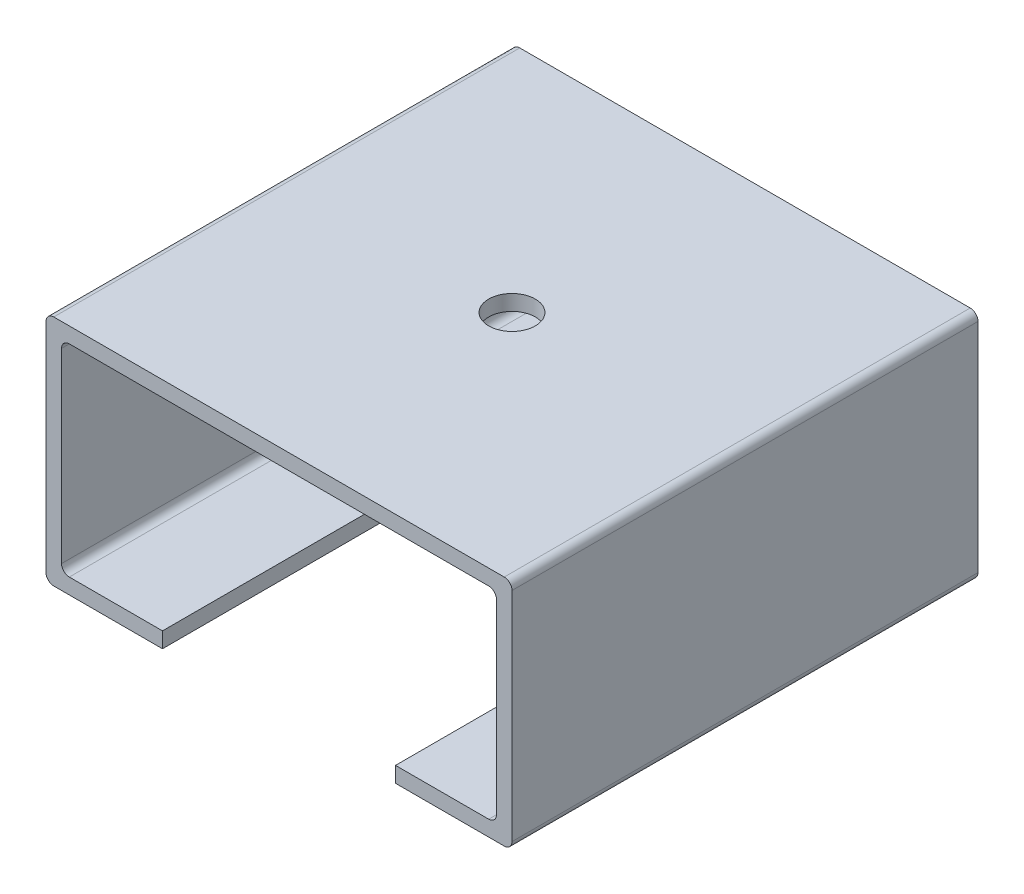
ISO-10303-21;
HEADER;
FILE_DESCRIPTION(('STEP AP214'),'2;1');
FILE_NAME('part.step','',(''),(''),'','','');
FILE_SCHEMA(('AUTOMOTIVE_DESIGN { 1 0 10303 214 1 1 1 1 }'));
ENDSEC;
DATA;
#1=APPLICATION_CONTEXT('core data for automotive mechanical design processes');
#2=APPLICATION_PROTOCOL_DEFINITION('international standard','automotive_design',2000,#1);
#3=PRODUCT_CONTEXT('',#1,'mechanical');
#4=PRODUCT('Part','Part','',(#3));
#5=PRODUCT_RELATED_PRODUCT_CATEGORY('part','',(#4));
#6=PRODUCT_DEFINITION_FORMATION('','',#4);
#7=PRODUCT_DEFINITION_CONTEXT('part definition',#1,'design');
#8=PRODUCT_DEFINITION('design','',#6,#7);
#9=PRODUCT_DEFINITION_SHAPE('','',#8);
#10=(LENGTH_UNIT() NAMED_UNIT(*) SI_UNIT(.MILLI.,.METRE.));
#11=(NAMED_UNIT(*) PLANE_ANGLE_UNIT() SI_UNIT($,.RADIAN.));
#12=(NAMED_UNIT(*) SI_UNIT($,.STERADIAN.) SOLID_ANGLE_UNIT());
#13=UNCERTAINTY_MEASURE_WITH_UNIT(LENGTH_MEASURE(1.E-05),#10,'distance_accuracy_value','');
#14=(GEOMETRIC_REPRESENTATION_CONTEXT(3) GLOBAL_UNCERTAINTY_ASSIGNED_CONTEXT((#13)) GLOBAL_UNIT_ASSIGNED_CONTEXT((#10,
#11,#12)) REPRESENTATION_CONTEXT('',''));
#15=CARTESIAN_POINT('',(0.,0.,0.));
#16=DIRECTION('',(0.,0.,1.));
#17=DIRECTION('',(1.,0.,0.));
#18=AXIS2_PLACEMENT_3D('',#15,#16,#17);
#19=CARTESIAN_POINT('',(15.,0.,60.));
#20=DIRECTION('',(1.,0.,0.));
#21=DIRECTION('',(0.,0.,-1.));
#22=AXIS2_PLACEMENT_3D('',#19,#20,#21);
#23=PLANE('',#22);
#24=DIRECTION('',(0.,-1.,0.));
#25=VECTOR('',#24,1.);
#26=CARTESIAN_POINT('',(15.,0.,0.));
#27=LINE('',#26,#25);
#28=CARTESIAN_POINT('',(15.,2.,0.));
#29=VERTEX_POINT('',#28);
#30=CARTESIAN_POINT('',(15.,0.,0.));
#31=VERTEX_POINT('',#30);
#32=EDGE_CURVE('E193',#29,#31,#27,.T.);
#33=ORIENTED_EDGE('',*,*,#32,.T.);
#34=DIRECTION('',(0.,0.,-1.));
#35=VECTOR('',#34,1.);
#36=CARTESIAN_POINT('',(15.,0.,60.));
#37=LINE('',#36,#35);
#38=CARTESIAN_POINT('',(15.,0.,60.));
#39=VERTEX_POINT('',#38);
#40=EDGE_CURVE('E175',#39,#31,#37,.T.);
#41=ORIENTED_EDGE('',*,*,#40,.F.);
#42=DIRECTION('',(0.,-1.,0.));
#43=VECTOR('',#42,1.);
#44=CARTESIAN_POINT('',(15.,0.,60.));
#45=LINE('',#44,#43);
#46=CARTESIAN_POINT('',(15.,2.,60.));
#47=VERTEX_POINT('',#46);
#48=EDGE_CURVE('E181',#47,#39,#45,.T.);
#49=ORIENTED_EDGE('',*,*,#48,.F.);
#50=DIRECTION('',(0.,0.,-1.));
#51=VECTOR('',#50,1.);
#52=CARTESIAN_POINT('',(15.,2.,60.));
#53=LINE('',#52,#51);
#54=EDGE_CURVE('E306',#47,#29,#53,.T.);
#55=ORIENTED_EDGE('',*,*,#54,.T.);
#56=EDGE_LOOP('',(#33,#41,#49,#55));
#57=FACE_BOUND('',#56,.T.);
#58=ADVANCED_FACE('F32',(#57),#23,.F.);
#59=CARTESIAN_POINT('',(15.,0.,60.));
#60=DIRECTION('',(0.,1.,0.));
#61=DIRECTION('',(0.,0.,1.));
#62=AXIS2_PLACEMENT_3D('',#59,#60,#61);
#63=PLANE('',#62);
#64=DIRECTION('',(1.,0.,0.));
#65=VECTOR('',#64,1.);
#66=CARTESIAN_POINT('',(15.,0.,0.));
#67=LINE('',#66,#65);
#68=CARTESIAN_POINT('',(29.,0.,0.));
#69=VERTEX_POINT('',#68);
#70=EDGE_CURVE('E308',#31,#69,#67,.T.);
#71=ORIENTED_EDGE('',*,*,#70,.T.);
#72=DIRECTION('',(0.,0.,-1.));
#73=VECTOR('',#72,1.);
#74=CARTESIAN_POINT('',(29.,0.,60.));
#75=LINE('',#74,#73);
#76=CARTESIAN_POINT('',(29.,0.,60.));
#77=VERTEX_POINT('',#76);
#78=EDGE_CURVE('E178',#69,#77,#75,.F.);
#79=ORIENTED_EDGE('',*,*,#78,.T.);
#80=DIRECTION('',(1.,0.,0.));
#81=VECTOR('',#80,1.);
#82=CARTESIAN_POINT('',(15.,0.,60.));
#83=LINE('',#82,#81);
#84=EDGE_CURVE('E170',#39,#77,#83,.T.);
#85=ORIENTED_EDGE('',*,*,#84,.F.);
#86=ORIENTED_EDGE('',*,*,#40,.T.);
#87=EDGE_LOOP('',(#71,#79,#85,#86));
#88=FACE_BOUND('',#87,.T.);
#89=ADVANCED_FACE('F173',(#88),#63,.F.);
#90=CARTESIAN_POINT('',(30.,0.,60.));
#91=DIRECTION('',(-1.,0.,0.));
#92=DIRECTION('',(0.,0.,1.));
#93=AXIS2_PLACEMENT_3D('',#90,#91,#92);
#94=PLANE('',#93);
#95=DIRECTION('',(0.,1.,0.));
#96=VECTOR('',#95,1.);
#97=CARTESIAN_POINT('',(30.,0.,60.));
#98=LINE('',#97,#96);
#99=CARTESIAN_POINT('',(30.,1.,60.));
#100=VERTEX_POINT('',#99);
#101=CARTESIAN_POINT('',(30.,29.,60.));
#102=VERTEX_POINT('',#101);
#103=EDGE_CURVE('E180',#100,#102,#98,.T.);
#104=ORIENTED_EDGE('',*,*,#103,.F.);
#105=DIRECTION('',(0.,0.,-1.));
#106=VECTOR('',#105,1.);
#107=CARTESIAN_POINT('',(30.,1.,60.));
#108=LINE('',#107,#106);
#109=CARTESIAN_POINT('',(30.,1.,0.));
#110=VERTEX_POINT('',#109);
#111=EDGE_CURVE('E227',#100,#110,#108,.T.);
#112=ORIENTED_EDGE('',*,*,#111,.T.);
#113=DIRECTION('',(0.,1.,0.));
#114=VECTOR('',#113,1.);
#115=CARTESIAN_POINT('',(30.,0.,0.));
#116=LINE('',#115,#114);
#117=CARTESIAN_POINT('',(30.,29.,0.));
#118=VERTEX_POINT('',#117);
#119=EDGE_CURVE('E311',#110,#118,#116,.T.);
#120=ORIENTED_EDGE('',*,*,#119,.T.);
#121=DIRECTION('',(0.,0.,-1.));
#122=VECTOR('',#121,1.);
#123=CARTESIAN_POINT('',(30.,29.,60.));
#124=LINE('',#123,#122);
#125=EDGE_CURVE('E225',#118,#102,#124,.F.);
#126=ORIENTED_EDGE('',*,*,#125,.T.);
#127=EDGE_LOOP('',(#104,#112,#120,#126));
#128=FACE_BOUND('',#127,.T.);
#129=ADVANCED_FACE('F340',(#128),#94,.F.);
#130=CARTESIAN_POINT('',(30.,30.,60.));
#131=DIRECTION('',(0.,-1.,0.));
#132=DIRECTION('',(1.,0.,0.));
#133=AXIS2_PLACEMENT_3D('',#130,#131,#132);
#134=PLANE('',#133);
#135=CARTESIAN_POINT('',(0.,30.,30.));
#136=DIRECTION('',(0.,1.,0.));
#137=DIRECTION('',(-1.,0.,0.));
#138=AXIS2_PLACEMENT_3D('',#135,#136,#137);
#139=CIRCLE('',#138,3.);
#140=CARTESIAN_POINT('',(-3.,30.,30.));
#141=VERTEX_POINT('',#140);
#142=EDGE_CURVE('E550',#141,#141,#139,.T.);
#143=ORIENTED_EDGE('',*,*,#142,.F.);
#144=EDGE_LOOP('',(#143));
#145=FACE_BOUND('',#144,.T.);
#146=DIRECTION('',(-1.,0.,0.));
#147=VECTOR('',#146,1.);
#148=CARTESIAN_POINT('',(30.,30.,60.));
#149=LINE('',#148,#147);
#150=CARTESIAN_POINT('',(29.,30.,60.));
#151=VERTEX_POINT('',#150);
#152=CARTESIAN_POINT('',(-29.,30.,60.));
#153=VERTEX_POINT('',#152);
#154=EDGE_CURVE('E342',#151,#153,#149,.T.);
#155=ORIENTED_EDGE('',*,*,#154,.F.);
#156=DIRECTION('',(0.,0.,-1.));
#157=VECTOR('',#156,1.);
#158=CARTESIAN_POINT('',(29.,30.,60.));
#159=LINE('',#158,#157);
#160=CARTESIAN_POINT('',(29.,30.,0.));
#161=VERTEX_POINT('',#160);
#162=EDGE_CURVE('E233',#151,#161,#159,.T.);
#163=ORIENTED_EDGE('',*,*,#162,.T.);
#164=DIRECTION('',(-1.,0.,0.));
#165=VECTOR('',#164,1.);
#166=CARTESIAN_POINT('',(30.,30.,0.));
#167=LINE('',#166,#165);
#168=CARTESIAN_POINT('',(-29.,30.,0.));
#169=VERTEX_POINT('',#168);
#170=EDGE_CURVE('E314',#161,#169,#167,.T.);
#171=ORIENTED_EDGE('',*,*,#170,.T.);
#172=DIRECTION('',(0.,0.,-1.));
#173=VECTOR('',#172,1.);
#174=CARTESIAN_POINT('',(-29.,30.,60.));
#175=LINE('',#174,#173);
#176=EDGE_CURVE('E231',#169,#153,#175,.F.);
#177=ORIENTED_EDGE('',*,*,#176,.T.);
#178=EDGE_LOOP('',(#155,#163,#171,#177));
#179=FACE_BOUND('',#178,.T.);
#180=ADVANCED_FACE('F374',(#145,#179),#134,.F.);
#181=CARTESIAN_POINT('',(-30.,30.,60.));
#182=DIRECTION('',(1.,0.,0.));
#183=DIRECTION('',(0.,0.,-1.));
#184=AXIS2_PLACEMENT_3D('',#181,#182,#183);
#185=PLANE('',#184);
#186=DIRECTION('',(0.,-1.,0.));
#187=VECTOR('',#186,1.);
#188=CARTESIAN_POINT('',(-30.,30.,0.));
#189=LINE('',#188,#187);
#190=CARTESIAN_POINT('',(-30.,29.,0.));
#191=VERTEX_POINT('',#190);
#192=CARTESIAN_POINT('',(-30.,1.,0.));
#193=VERTEX_POINT('',#192);
#194=EDGE_CURVE('E317',#191,#193,#189,.T.);
#195=ORIENTED_EDGE('',*,*,#194,.T.);
#196=DIRECTION('',(0.,0.,-1.));
#197=VECTOR('',#196,1.);
#198=CARTESIAN_POINT('',(-30.,1.,60.));
#199=LINE('',#198,#197);
#200=CARTESIAN_POINT('',(-30.,1.,60.));
#201=VERTEX_POINT('',#200);
#202=EDGE_CURVE('E215',#193,#201,#199,.F.);
#203=ORIENTED_EDGE('',*,*,#202,.T.);
#204=DIRECTION('',(0.,-1.,0.));
#205=VECTOR('',#204,1.);
#206=CARTESIAN_POINT('',(-30.,30.,60.));
#207=LINE('',#206,#205);
#208=CARTESIAN_POINT('',(-30.,29.,60.));
#209=VERTEX_POINT('',#208);
#210=EDGE_CURVE('E345',#209,#201,#207,.T.);
#211=ORIENTED_EDGE('',*,*,#210,.F.);
#212=DIRECTION('',(0.,0.,-1.));
#213=VECTOR('',#212,1.);
#214=CARTESIAN_POINT('',(-30.,29.,60.));
#215=LINE('',#214,#213);
#216=EDGE_CURVE('E212',#209,#191,#215,.T.);
#217=ORIENTED_EDGE('',*,*,#216,.T.);
#218=EDGE_LOOP('',(#195,#203,#211,#217));
#219=FACE_BOUND('',#218,.T.);
#220=ADVANCED_FACE('F365',(#219),#185,.F.);
#221=CARTESIAN_POINT('',(-30.,0.,60.));
#222=DIRECTION('',(0.,1.,0.));
#223=DIRECTION('',(0.,0.,1.));
#224=AXIS2_PLACEMENT_3D('',#221,#222,#223);
#225=PLANE('',#224);
#226=DIRECTION('',(1.,0.,0.));
#227=VECTOR('',#226,1.);
#228=CARTESIAN_POINT('',(-30.,0.,60.));
#229=LINE('',#228,#227);
#230=CARTESIAN_POINT('',(-29.,0.,60.));
#231=VERTEX_POINT('',#230);
#232=CARTESIAN_POINT('',(-15.,0.,60.));
#233=VERTEX_POINT('',#232);
#234=EDGE_CURVE('E349',#231,#233,#229,.T.);
#235=ORIENTED_EDGE('',*,*,#234,.F.);
#236=DIRECTION('',(0.,0.,-1.));
#237=VECTOR('',#236,1.);
#238=CARTESIAN_POINT('',(-29.,0.,60.));
#239=LINE('',#238,#237);
#240=CARTESIAN_POINT('',(-29.,0.,0.));
#241=VERTEX_POINT('',#240);
#242=EDGE_CURVE('E194',#231,#241,#239,.T.);
#243=ORIENTED_EDGE('',*,*,#242,.T.);
#244=DIRECTION('',(1.,0.,0.));
#245=VECTOR('',#244,1.);
#246=CARTESIAN_POINT('',(-30.,0.,0.));
#247=LINE('',#246,#245);
#248=CARTESIAN_POINT('',(-15.,0.,0.));
#249=VERTEX_POINT('',#248);
#250=EDGE_CURVE('E320',#241,#249,#247,.T.);
#251=ORIENTED_EDGE('',*,*,#250,.T.);
#252=DIRECTION('',(0.,0.,-1.));
#253=VECTOR('',#252,1.);
#254=CARTESIAN_POINT('',(-15.,0.,60.));
#255=LINE('',#254,#253);
#256=EDGE_CURVE('E195',#233,#249,#255,.T.);
#257=ORIENTED_EDGE('',*,*,#256,.F.);
#258=EDGE_LOOP('',(#235,#243,#251,#257));
#259=FACE_BOUND('',#258,.T.);
#260=ADVANCED_FACE('F357',(#259),#225,.F.);
#261=CARTESIAN_POINT('',(-15.,0.,60.));
#262=DIRECTION('',(-1.,0.,0.));
#263=DIRECTION('',(0.,0.,1.));
#264=AXIS2_PLACEMENT_3D('',#261,#262,#263);
#265=PLANE('',#264);
#266=DIRECTION('',(0.,1.,0.));
#267=VECTOR('',#266,1.);
#268=CARTESIAN_POINT('',(-15.,0.,0.));
#269=LINE('',#268,#267);
#270=CARTESIAN_POINT('',(-15.,2.,0.));
#271=VERTEX_POINT('',#270);
#272=EDGE_CURVE('E284',#249,#271,#269,.T.);
#273=ORIENTED_EDGE('',*,*,#272,.T.);
#274=DIRECTION('',(0.,0.,-1.));
#275=VECTOR('',#274,1.);
#276=CARTESIAN_POINT('',(-15.,2.,60.));
#277=LINE('',#276,#275);
#278=CARTESIAN_POINT('',(-15.,2.,60.));
#279=VERTEX_POINT('',#278);
#280=EDGE_CURVE('E201',#279,#271,#277,.T.);
#281=ORIENTED_EDGE('',*,*,#280,.F.);
#282=DIRECTION('',(0.,1.,0.));
#283=VECTOR('',#282,1.);
#284=CARTESIAN_POINT('',(-15.,0.,60.));
#285=LINE('',#284,#283);
#286=EDGE_CURVE('E300',#233,#279,#285,.T.);
#287=ORIENTED_EDGE('',*,*,#286,.F.);
#288=ORIENTED_EDGE('',*,*,#256,.T.);
#289=EDGE_LOOP('',(#273,#281,#287,#288));
#290=FACE_BOUND('',#289,.T.);
#291=ADVANCED_FACE('F354',(#290),#265,.F.);
#292=CARTESIAN_POINT('',(-15.,2.,60.));
#293=DIRECTION('',(0.,-1.,0.));
#294=DIRECTION('',(1.,0.,0.));
#295=AXIS2_PLACEMENT_3D('',#292,#293,#294);
#296=PLANE('',#295);
#297=DIRECTION('',(-1.,0.,0.));
#298=VECTOR('',#297,1.);
#299=CARTESIAN_POINT('',(-15.,2.,0.));
#300=LINE('',#299,#298);
#301=CARTESIAN_POINT('',(-27.,2.,0.));
#302=VERTEX_POINT('',#301);
#303=EDGE_CURVE('E272',#271,#302,#300,.T.);
#304=ORIENTED_EDGE('',*,*,#303,.T.);
#305=DIRECTION('',(0.,0.,-1.));
#306=VECTOR('',#305,1.);
#307=CARTESIAN_POINT('',(-27.,2.,60.));
#308=LINE('',#307,#306);
#309=CARTESIAN_POINT('',(-27.,2.,60.));
#310=VERTEX_POINT('',#309);
#311=EDGE_CURVE('E253',#302,#310,#308,.F.);
#312=ORIENTED_EDGE('',*,*,#311,.T.);
#313=DIRECTION('',(-1.,0.,0.));
#314=VECTOR('',#313,1.);
#315=CARTESIAN_POINT('',(-15.,2.,60.));
#316=LINE('',#315,#314);
#317=EDGE_CURVE('E291',#279,#310,#316,.T.);
#318=ORIENTED_EDGE('',*,*,#317,.F.);
#319=ORIENTED_EDGE('',*,*,#280,.T.);
#320=EDGE_LOOP('',(#304,#312,#318,#319));
#321=FACE_BOUND('',#320,.T.);
#322=ADVANCED_FACE('F280',(#321),#296,.F.);
#323=CARTESIAN_POINT('',(-28.,2.,60.));
#324=DIRECTION('',(-1.,0.,0.));
#325=DIRECTION('',(0.,0.,1.));
#326=AXIS2_PLACEMENT_3D('',#323,#324,#325);
#327=PLANE('',#326);
#328=DIRECTION('',(0.,1.,0.));
#329=VECTOR('',#328,1.);
#330=CARTESIAN_POINT('',(-28.,2.,0.));
#331=LINE('',#330,#329);
#332=CARTESIAN_POINT('',(-28.,3.,0.));
#333=VERTEX_POINT('',#332);
#334=CARTESIAN_POINT('',(-28.,27.,0.));
#335=VERTEX_POINT('',#334);
#336=EDGE_CURVE('E274',#333,#335,#331,.T.);
#337=ORIENTED_EDGE('',*,*,#336,.T.);
#338=DIRECTION('',(0.,0.,-1.));
#339=VECTOR('',#338,1.);
#340=CARTESIAN_POINT('',(-28.,27.,60.));
#341=LINE('',#340,#339);
#342=CARTESIAN_POINT('',(-28.,27.,60.));
#343=VERTEX_POINT('',#342);
#344=EDGE_CURVE('E251',#335,#343,#341,.F.);
#345=ORIENTED_EDGE('',*,*,#344,.T.);
#346=DIRECTION('',(0.,1.,0.));
#347=VECTOR('',#346,1.);
#348=CARTESIAN_POINT('',(-28.,2.,60.));
#349=LINE('',#348,#347);
#350=CARTESIAN_POINT('',(-28.,3.,60.));
#351=VERTEX_POINT('',#350);
#352=EDGE_CURVE('E289',#351,#343,#349,.T.);
#353=ORIENTED_EDGE('',*,*,#352,.F.);
#354=DIRECTION('',(0.,0.,-1.));
#355=VECTOR('',#354,1.);
#356=CARTESIAN_POINT('',(-28.,3.,0.));
#357=LINE('',#356,#355);
#358=EDGE_CURVE('E248',#351,#333,#357,.T.);
#359=ORIENTED_EDGE('',*,*,#358,.T.);
#360=EDGE_LOOP('',(#337,#345,#353,#359));
#361=FACE_BOUND('',#360,.T.);
#362=ADVANCED_FACE('F293',(#361),#327,.F.);
#363=CARTESIAN_POINT('',(28.,28.,60.));
#364=DIRECTION('',(0.,1.,0.));
#365=DIRECTION('',(0.,0.,1.));
#366=AXIS2_PLACEMENT_3D('',#363,#364,#365);
#367=PLANE('',#366);
#368=CARTESIAN_POINT('',(0.,28.,30.));
#369=DIRECTION('',(0.,1.,0.));
#370=DIRECTION('',(-1.,0.,0.));
#371=AXIS2_PLACEMENT_3D('',#368,#369,#370);
#372=CIRCLE('',#371,3.);
#373=CARTESIAN_POINT('',(-3.,28.,30.));
#374=VERTEX_POINT('',#373);
#375=EDGE_CURVE('E309',#374,#374,#372,.T.);
#376=ORIENTED_EDGE('',*,*,#375,.T.);
#377=EDGE_LOOP('',(#376));
#378=FACE_BOUND('',#377,.T.);
#379=DIRECTION('',(1.,0.,0.));
#380=VECTOR('',#379,1.);
#381=CARTESIAN_POINT('',(28.,28.,0.));
#382=LINE('',#381,#380);
#383=CARTESIAN_POINT('',(-27.,28.,0.));
#384=VERTEX_POINT('',#383);
#385=CARTESIAN_POINT('',(27.,28.,0.));
#386=VERTEX_POINT('',#385);
#387=EDGE_CURVE('E324',#384,#386,#382,.T.);
#388=ORIENTED_EDGE('',*,*,#387,.T.);
#389=DIRECTION('',(0.,0.,-1.));
#390=VECTOR('',#389,1.);
#391=CARTESIAN_POINT('',(27.,28.,60.));
#392=LINE('',#391,#390);
#393=CARTESIAN_POINT('',(27.,28.,60.));
#394=VERTEX_POINT('',#393);
#395=EDGE_CURVE('E246',#386,#394,#392,.F.);
#396=ORIENTED_EDGE('',*,*,#395,.T.);
#397=DIRECTION('',(1.,0.,0.));
#398=VECTOR('',#397,1.);
#399=CARTESIAN_POINT('',(28.,28.,60.));
#400=LINE('',#399,#398);
#401=CARTESIAN_POINT('',(-27.,28.,60.));
#402=VERTEX_POINT('',#401);
#403=EDGE_CURVE('E295',#402,#394,#400,.T.);
#404=ORIENTED_EDGE('',*,*,#403,.F.);
#405=DIRECTION('',(0.,0.,-1.));
#406=VECTOR('',#405,1.);
#407=CARTESIAN_POINT('',(-27.,28.,0.));
#408=LINE('',#407,#406);
#409=EDGE_CURVE('E243',#402,#384,#408,.T.);
#410=ORIENTED_EDGE('',*,*,#409,.T.);
#411=EDGE_LOOP('',(#388,#396,#404,#410));
#412=FACE_BOUND('',#411,.T.);
#413=ADVANCED_FACE('F412',(#378,#412),#367,.F.);
#414=CARTESIAN_POINT('',(28.,2.,60.));
#415=DIRECTION('',(1.,0.,0.));
#416=DIRECTION('',(0.,0.,-1.));
#417=AXIS2_PLACEMENT_3D('',#414,#415,#416);
#418=PLANE('',#417);
#419=DIRECTION('',(0.,-1.,0.));
#420=VECTOR('',#419,1.);
#421=CARTESIAN_POINT('',(28.,2.,0.));
#422=LINE('',#421,#420);
#423=CARTESIAN_POINT('',(28.,27.,0.));
#424=VERTEX_POINT('',#423);
#425=CARTESIAN_POINT('',(28.,3.,0.));
#426=VERTEX_POINT('',#425);
#427=EDGE_CURVE('E327',#424,#426,#422,.T.);
#428=ORIENTED_EDGE('',*,*,#427,.T.);
#429=DIRECTION('',(0.,0.,-1.));
#430=VECTOR('',#429,1.);
#431=CARTESIAN_POINT('',(28.,3.,60.));
#432=LINE('',#431,#430);
#433=CARTESIAN_POINT('',(28.,3.,60.));
#434=VERTEX_POINT('',#433);
#435=EDGE_CURVE('E55',#426,#434,#432,.F.);
#436=ORIENTED_EDGE('',*,*,#435,.T.);
#437=DIRECTION('',(0.,-1.,0.));
#438=VECTOR('',#437,1.);
#439=CARTESIAN_POINT('',(28.,2.,60.));
#440=LINE('',#439,#438);
#441=CARTESIAN_POINT('',(28.,27.,60.));
#442=VERTEX_POINT('',#441);
#443=EDGE_CURVE('E298',#442,#434,#440,.T.);
#444=ORIENTED_EDGE('',*,*,#443,.F.);
#445=DIRECTION('',(0.,0.,-1.));
#446=VECTOR('',#445,1.);
#447=CARTESIAN_POINT('',(28.,27.,0.));
#448=LINE('',#447,#446);
#449=EDGE_CURVE('E239',#442,#424,#448,.T.);
#450=ORIENTED_EDGE('',*,*,#449,.T.);
#451=EDGE_LOOP('',(#428,#436,#444,#450));
#452=FACE_BOUND('',#451,.T.);
#453=ADVANCED_FACE('F409',(#452),#418,.F.);
#454=CARTESIAN_POINT('',(15.,2.,60.));
#455=DIRECTION('',(0.,-1.,0.));
#456=DIRECTION('',(0.,0.,-1.));
#457=AXIS2_PLACEMENT_3D('',#454,#455,#456);
#458=PLANE('',#457);
#459=DIRECTION('',(-1.,0.,0.));
#460=VECTOR('',#459,1.);
#461=CARTESIAN_POINT('',(15.,2.,60.));
#462=LINE('',#461,#460);
#463=CARTESIAN_POINT('',(27.,2.,60.));
#464=VERTEX_POINT('',#463);
#465=EDGE_CURVE('E186',#464,#47,#462,.T.);
#466=ORIENTED_EDGE('',*,*,#465,.F.);
#467=DIRECTION('',(0.,0.,-1.));
#468=VECTOR('',#467,1.);
#469=CARTESIAN_POINT('',(27.,2.,0.));
#470=LINE('',#469,#468);
#471=CARTESIAN_POINT('',(27.,2.,0.));
#472=VERTEX_POINT('',#471);
#473=EDGE_CURVE('E236',#464,#472,#470,.T.);
#474=ORIENTED_EDGE('',*,*,#473,.T.);
#475=DIRECTION('',(-1.,0.,0.));
#476=VECTOR('',#475,1.);
#477=CARTESIAN_POINT('',(15.,2.,0.));
#478=LINE('',#477,#476);
#479=EDGE_CURVE('E190',#472,#29,#478,.T.);
#480=ORIENTED_EDGE('',*,*,#479,.T.);
#481=ORIENTED_EDGE('',*,*,#54,.F.);
#482=EDGE_LOOP('',(#466,#474,#480,#481));
#483=FACE_BOUND('',#482,.T.);
#484=ADVANCED_FACE('F403',(#483),#458,.F.);
#485=CARTESIAN_POINT('',(0.,0.,60.));
#486=DIRECTION('',(0.,0.,-1.));
#487=DIRECTION('',(-1.,0.,0.));
#488=AXIS2_PLACEMENT_3D('',#485,#486,#487);
#489=PLANE('',#488);
#490=ORIENTED_EDGE('',*,*,#210,.T.);
#491=CARTESIAN_POINT('',(-29.,1.,60.));
#492=DIRECTION('',(0.,0.,-1.));
#493=DIRECTION('',(-1.,0.,0.));
#494=AXIS2_PLACEMENT_3D('',#491,#492,#493);
#495=CIRCLE('',#494,1.);
#496=EDGE_CURVE('E223',#201,#231,#495,.F.);
#497=ORIENTED_EDGE('',*,*,#496,.T.);
#498=ORIENTED_EDGE('',*,*,#234,.T.);
#499=ORIENTED_EDGE('',*,*,#286,.T.);
#500=ORIENTED_EDGE('',*,*,#317,.T.);
#501=CARTESIAN_POINT('',(-27.,3.,60.));
#502=DIRECTION('',(0.,0.,-1.));
#503=DIRECTION('',(-1.,0.,0.));
#504=AXIS2_PLACEMENT_3D('',#501,#502,#503);
#505=CIRCLE('',#504,1.);
#506=EDGE_CURVE('E11',#310,#351,#505,.T.);
#507=ORIENTED_EDGE('',*,*,#506,.T.);
#508=ORIENTED_EDGE('',*,*,#352,.T.);
#509=CARTESIAN_POINT('',(-27.,27.,60.));
#510=DIRECTION('',(0.,0.,-1.));
#511=DIRECTION('',(-1.,0.,0.));
#512=AXIS2_PLACEMENT_3D('',#509,#510,#511);
#513=CIRCLE('',#512,1.);
#514=EDGE_CURVE('E264',#343,#402,#513,.T.);
#515=ORIENTED_EDGE('',*,*,#514,.T.);
#516=ORIENTED_EDGE('',*,*,#403,.T.);
#517=CARTESIAN_POINT('',(27.,27.,60.));
#518=DIRECTION('',(0.,0.,-1.));
#519=DIRECTION('',(-1.,0.,0.));
#520=AXIS2_PLACEMENT_3D('',#517,#518,#519);
#521=CIRCLE('',#520,1.);
#522=EDGE_CURVE('E260',#394,#442,#521,.T.);
#523=ORIENTED_EDGE('',*,*,#522,.T.);
#524=ORIENTED_EDGE('',*,*,#443,.T.);
#525=CARTESIAN_POINT('',(27.,3.,60.));
#526=DIRECTION('',(0.,0.,-1.));
#527=DIRECTION('',(-1.,0.,0.));
#528=AXIS2_PLACEMENT_3D('',#525,#526,#527);
#529=CIRCLE('',#528,1.);
#530=EDGE_CURVE('E47',#434,#464,#529,.T.);
#531=ORIENTED_EDGE('',*,*,#530,.T.);
#532=ORIENTED_EDGE('',*,*,#465,.T.);
#533=ORIENTED_EDGE('',*,*,#48,.T.);
#534=ORIENTED_EDGE('',*,*,#84,.T.);
#535=CARTESIAN_POINT('',(29.,1.,60.));
#536=DIRECTION('',(0.,0.,-1.));
#537=DIRECTION('',(-1.,0.,0.));
#538=AXIS2_PLACEMENT_3D('',#535,#536,#537);
#539=CIRCLE('',#538,1.);
#540=EDGE_CURVE('E221',#77,#100,#539,.F.);
#541=ORIENTED_EDGE('',*,*,#540,.T.);
#542=ORIENTED_EDGE('',*,*,#103,.T.);
#543=CARTESIAN_POINT('',(29.,29.,60.));
#544=DIRECTION('',(0.,0.,-1.));
#545=DIRECTION('',(-1.,0.,0.));
#546=AXIS2_PLACEMENT_3D('',#543,#544,#545);
#547=CIRCLE('',#546,1.);
#548=EDGE_CURVE('E219',#102,#151,#547,.F.);
#549=ORIENTED_EDGE('',*,*,#548,.T.);
#550=ORIENTED_EDGE('',*,*,#154,.T.);
#551=CARTESIAN_POINT('',(-29.,29.,60.));
#552=DIRECTION('',(0.,0.,-1.));
#553=DIRECTION('',(-1.,0.,0.));
#554=AXIS2_PLACEMENT_3D('',#551,#552,#553);
#555=CIRCLE('',#554,1.);
#556=EDGE_CURVE('E217',#153,#209,#555,.F.);
#557=ORIENTED_EDGE('',*,*,#556,.T.);
#558=EDGE_LOOP('',(#490,#497,#498,#499,#500,#507,#508,#515,#516,#523,#524,#531,#532,#533,#534,
#541,#542,#549,#550,#557));
#559=FACE_BOUND('',#558,.T.);
#560=ADVANCED_FACE('F185',(#559),#489,.F.);
#561=CARTESIAN_POINT('',(0.,0.,0.));
#562=DIRECTION('',(0.,0.,-1.));
#563=DIRECTION('',(-1.,0.,0.));
#564=AXIS2_PLACEMENT_3D('',#561,#562,#563);
#565=PLANE('',#564);
#566=ORIENTED_EDGE('',*,*,#250,.F.);
#567=CARTESIAN_POINT('',(-29.,1.,0.));
#568=DIRECTION('',(0.,0.,-1.));
#569=DIRECTION('',(-1.,0.,0.));
#570=AXIS2_PLACEMENT_3D('',#567,#568,#569);
#571=CIRCLE('',#570,1.);
#572=EDGE_CURVE('E210',#241,#193,#571,.T.);
#573=ORIENTED_EDGE('',*,*,#572,.T.);
#574=ORIENTED_EDGE('',*,*,#194,.F.);
#575=CARTESIAN_POINT('',(-29.,29.,0.));
#576=DIRECTION('',(0.,0.,-1.));
#577=DIRECTION('',(-1.,0.,0.));
#578=AXIS2_PLACEMENT_3D('',#575,#576,#577);
#579=CIRCLE('',#578,1.);
#580=EDGE_CURVE('E198',#191,#169,#579,.T.);
#581=ORIENTED_EDGE('',*,*,#580,.T.);
#582=ORIENTED_EDGE('',*,*,#170,.F.);
#583=CARTESIAN_POINT('',(29.,29.,0.));
#584=DIRECTION('',(0.,0.,-1.));
#585=DIRECTION('',(-1.,0.,0.));
#586=AXIS2_PLACEMENT_3D('',#583,#584,#585);
#587=CIRCLE('',#586,1.);
#588=EDGE_CURVE('E206',#161,#118,#587,.T.);
#589=ORIENTED_EDGE('',*,*,#588,.T.);
#590=ORIENTED_EDGE('',*,*,#119,.F.);
#591=CARTESIAN_POINT('',(29.,1.,0.));
#592=DIRECTION('',(0.,0.,-1.));
#593=DIRECTION('',(-1.,0.,0.));
#594=AXIS2_PLACEMENT_3D('',#591,#592,#593);
#595=CIRCLE('',#594,1.);
#596=EDGE_CURVE('E208',#110,#69,#595,.T.);
#597=ORIENTED_EDGE('',*,*,#596,.T.);
#598=ORIENTED_EDGE('',*,*,#70,.F.);
#599=ORIENTED_EDGE('',*,*,#32,.F.);
#600=ORIENTED_EDGE('',*,*,#479,.F.);
#601=CARTESIAN_POINT('',(27.,3.,0.));
#602=DIRECTION('',(0.,0.,-1.));
#603=DIRECTION('',(-1.,0.,0.));
#604=AXIS2_PLACEMENT_3D('',#601,#602,#603);
#605=CIRCLE('',#604,1.);
#606=EDGE_CURVE('E255',#472,#426,#605,.F.);
#607=ORIENTED_EDGE('',*,*,#606,.T.);
#608=ORIENTED_EDGE('',*,*,#427,.F.);
#609=CARTESIAN_POINT('',(27.,27.,0.));
#610=DIRECTION('',(0.,0.,-1.));
#611=DIRECTION('',(-1.,0.,0.));
#612=AXIS2_PLACEMENT_3D('',#609,#610,#611);
#613=CIRCLE('',#612,1.);
#614=EDGE_CURVE('E258',#424,#386,#613,.F.);
#615=ORIENTED_EDGE('',*,*,#614,.T.);
#616=ORIENTED_EDGE('',*,*,#387,.F.);
#617=CARTESIAN_POINT('',(-27.,27.,0.));
#618=DIRECTION('',(0.,0.,-1.));
#619=DIRECTION('',(-1.,0.,0.));
#620=AXIS2_PLACEMENT_3D('',#617,#618,#619);
#621=CIRCLE('',#620,1.);
#622=EDGE_CURVE('E262',#384,#335,#621,.F.);
#623=ORIENTED_EDGE('',*,*,#622,.T.);
#624=ORIENTED_EDGE('',*,*,#336,.F.);
#625=CARTESIAN_POINT('',(-27.,3.,0.));
#626=DIRECTION('',(0.,0.,-1.));
#627=DIRECTION('',(-1.,0.,0.));
#628=AXIS2_PLACEMENT_3D('',#625,#626,#627);
#629=CIRCLE('',#628,1.);
#630=EDGE_CURVE('E40',#333,#302,#629,.F.);
#631=ORIENTED_EDGE('',*,*,#630,.T.);
#632=ORIENTED_EDGE('',*,*,#303,.F.);
#633=ORIENTED_EDGE('',*,*,#272,.F.);
#634=EDGE_LOOP('',(#566,#573,#574,#581,#582,#589,#590,#597,#598,#599,#600,#607,#608,#615,#616,
#623,#624,#631,#632,#633));
#635=FACE_BOUND('',#634,.T.);
#636=ADVANCED_FACE('F270',(#635),#565,.T.);
#637=CARTESIAN_POINT('',(-29.,1.,60.));
#638=DIRECTION('',(0.,0.,-1.));
#639=DIRECTION('',(-1.,0.,0.));
#640=AXIS2_PLACEMENT_3D('',#637,#638,#639);
#641=CYLINDRICAL_SURFACE('',#640,1.);
#642=ORIENTED_EDGE('',*,*,#496,.F.);
#643=ORIENTED_EDGE('',*,*,#202,.F.);
#644=ORIENTED_EDGE('',*,*,#572,.F.);
#645=ORIENTED_EDGE('',*,*,#242,.F.);
#646=EDGE_LOOP('',(#642,#643,#644,#645));
#647=FACE_BOUND('',#646,.T.);
#648=ADVANCED_FACE('F361',(#647),#641,.T.);
#649=CARTESIAN_POINT('',(29.,1.,60.));
#650=DIRECTION('',(0.,0.,-1.));
#651=DIRECTION('',(-1.,0.,0.));
#652=AXIS2_PLACEMENT_3D('',#649,#650,#651);
#653=CYLINDRICAL_SURFACE('',#652,1.);
#654=ORIENTED_EDGE('',*,*,#540,.F.);
#655=ORIENTED_EDGE('',*,*,#78,.F.);
#656=ORIENTED_EDGE('',*,*,#596,.F.);
#657=ORIENTED_EDGE('',*,*,#111,.F.);
#658=EDGE_LOOP('',(#654,#655,#656,#657));
#659=FACE_BOUND('',#658,.T.);
#660=ADVANCED_FACE('F334',(#659),#653,.T.);
#661=CARTESIAN_POINT('',(29.,29.,60.));
#662=DIRECTION('',(0.,0.,-1.));
#663=DIRECTION('',(-1.,0.,0.));
#664=AXIS2_PLACEMENT_3D('',#661,#662,#663);
#665=CYLINDRICAL_SURFACE('',#664,1.);
#666=ORIENTED_EDGE('',*,*,#548,.F.);
#667=ORIENTED_EDGE('',*,*,#125,.F.);
#668=ORIENTED_EDGE('',*,*,#588,.F.);
#669=ORIENTED_EDGE('',*,*,#162,.F.);
#670=EDGE_LOOP('',(#666,#667,#668,#669));
#671=FACE_BOUND('',#670,.T.);
#672=ADVANCED_FACE('F377',(#671),#665,.T.);
#673=CARTESIAN_POINT('',(-29.,29.,60.));
#674=DIRECTION('',(0.,0.,-1.));
#675=DIRECTION('',(-1.,0.,0.));
#676=AXIS2_PLACEMENT_3D('',#673,#674,#675);
#677=CYLINDRICAL_SURFACE('',#676,1.);
#678=ORIENTED_EDGE('',*,*,#556,.F.);
#679=ORIENTED_EDGE('',*,*,#176,.F.);
#680=ORIENTED_EDGE('',*,*,#580,.F.);
#681=ORIENTED_EDGE('',*,*,#216,.F.);
#682=EDGE_LOOP('',(#678,#679,#680,#681));
#683=FACE_BOUND('',#682,.T.);
#684=ADVANCED_FACE('F371',(#683),#677,.T.);
#685=CARTESIAN_POINT('',(27.,3.,60.));
#686=DIRECTION('',(0.,0.,1.));
#687=DIRECTION('',(1.,0.,0.));
#688=AXIS2_PLACEMENT_3D('',#685,#686,#687);
#689=CYLINDRICAL_SURFACE('',#688,1.);
#690=ORIENTED_EDGE('',*,*,#530,.F.);
#691=ORIENTED_EDGE('',*,*,#435,.F.);
#692=ORIENTED_EDGE('',*,*,#606,.F.);
#693=ORIENTED_EDGE('',*,*,#473,.F.);
#694=EDGE_LOOP('',(#690,#691,#692,#693));
#695=FACE_BOUND('',#694,.T.);
#696=ADVANCED_FACE('F384',(#695),#689,.F.);
#697=CARTESIAN_POINT('',(27.,27.,60.));
#698=DIRECTION('',(0.,0.,1.));
#699=DIRECTION('',(1.,0.,0.));
#700=AXIS2_PLACEMENT_3D('',#697,#698,#699);
#701=CYLINDRICAL_SURFACE('',#700,1.);
#702=ORIENTED_EDGE('',*,*,#522,.F.);
#703=ORIENTED_EDGE('',*,*,#395,.F.);
#704=ORIENTED_EDGE('',*,*,#614,.F.);
#705=ORIENTED_EDGE('',*,*,#449,.F.);
#706=EDGE_LOOP('',(#702,#703,#704,#705));
#707=FACE_BOUND('',#706,.T.);
#708=ADVANCED_FACE('F508',(#707),#701,.F.);
#709=CARTESIAN_POINT('',(-27.,27.,60.));
#710=DIRECTION('',(0.,0.,1.));
#711=DIRECTION('',(1.,0.,0.));
#712=AXIS2_PLACEMENT_3D('',#709,#710,#711);
#713=CYLINDRICAL_SURFACE('',#712,1.);
#714=ORIENTED_EDGE('',*,*,#514,.F.);
#715=ORIENTED_EDGE('',*,*,#344,.F.);
#716=ORIENTED_EDGE('',*,*,#622,.F.);
#717=ORIENTED_EDGE('',*,*,#409,.F.);
#718=EDGE_LOOP('',(#714,#715,#716,#717));
#719=FACE_BOUND('',#718,.T.);
#720=ADVANCED_FACE('F518',(#719),#713,.F.);
#721=CARTESIAN_POINT('',(-27.,3.,60.));
#722=DIRECTION('',(0.,0.,1.));
#723=DIRECTION('',(1.,0.,0.));
#724=AXIS2_PLACEMENT_3D('',#721,#722,#723);
#725=CYLINDRICAL_SURFACE('',#724,1.);
#726=ORIENTED_EDGE('',*,*,#506,.F.);
#727=ORIENTED_EDGE('',*,*,#311,.F.);
#728=ORIENTED_EDGE('',*,*,#630,.F.);
#729=ORIENTED_EDGE('',*,*,#358,.F.);
#730=EDGE_LOOP('',(#726,#727,#728,#729));
#731=FACE_BOUND('',#730,.T.);
#732=ADVANCED_FACE('F34',(#731),#725,.F.);
#733=CARTESIAN_POINT('',(0.,28.,30.));
#734=DIRECTION('',(0.,1.,0.));
#735=DIRECTION('',(-1.,0.,0.));
#736=AXIS2_PLACEMENT_3D('',#733,#734,#735);
#737=CYLINDRICAL_SURFACE('',#736,3.);
#738=ORIENTED_EDGE('',*,*,#375,.F.);
#739=EDGE_LOOP('',(#738));
#740=FACE_BOUND('',#739,.T.);
#741=ORIENTED_EDGE('',*,*,#142,.T.);
#742=EDGE_LOOP('',(#741));
#743=FACE_BOUND('',#742,.T.);
#744=ADVANCED_FACE('F534',(#740,#743),#737,.F.);
#745=CLOSED_SHELL('',(#58,#89,#129,#180,#220,#260,#291,#322,#362,#413,#453,#484,#560,#636,#648,
#660,#672,#684,#696,#708,#720,#732,#744));
#746=MANIFOLD_SOLID_BREP('B2',#745);
#747=ADVANCED_BREP_SHAPE_REPRESENTATION('',(#18,#746),#14);
#748=SHAPE_DEFINITION_REPRESENTATION(#9,#747);
ENDSEC;
END-ISO-10303-21;
